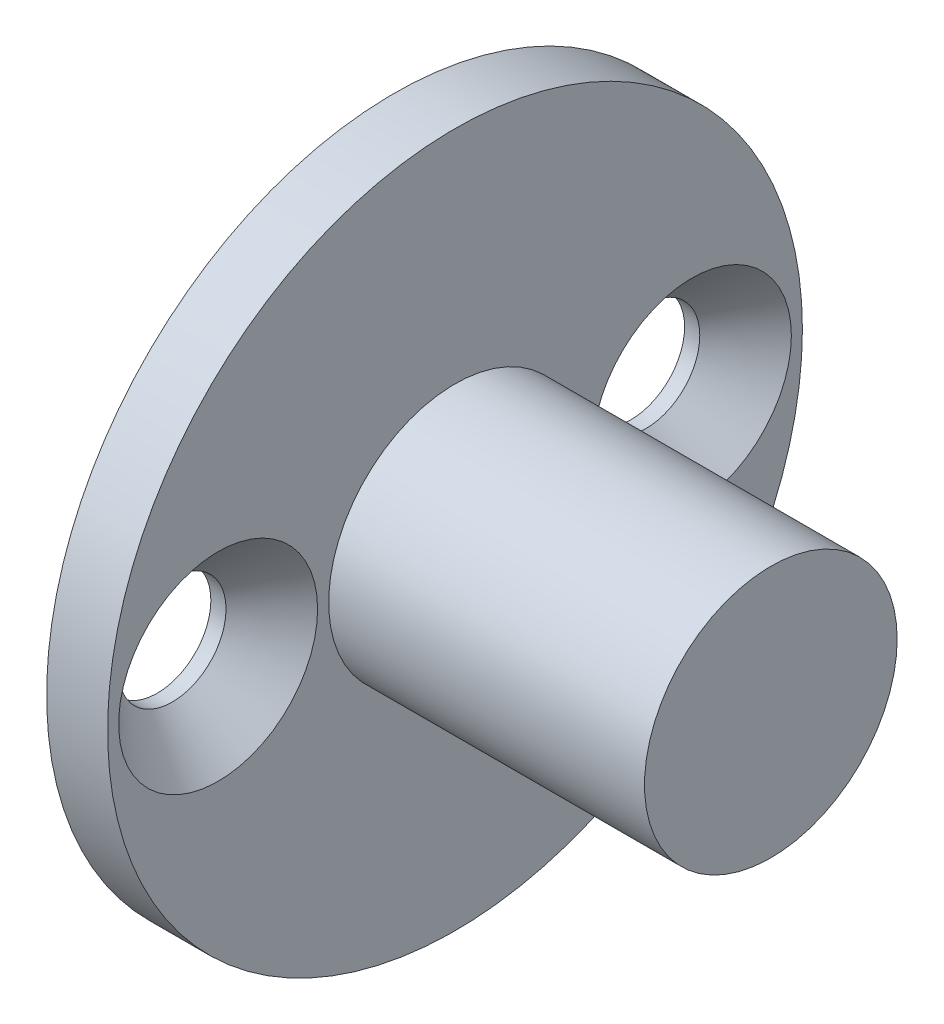
ISO-10303-21;
HEADER;
FILE_DESCRIPTION(('STEP AP214'),'2;1');
FILE_NAME('part.step','',(''),(''),'','','');
FILE_SCHEMA(('AUTOMOTIVE_DESIGN { 1 0 10303 214 1 1 1 1 }'));
ENDSEC;
DATA;
#1=APPLICATION_CONTEXT('core data for automotive mechanical design processes');
#2=APPLICATION_PROTOCOL_DEFINITION('international standard','automotive_design',2000,#1);
#3=PRODUCT_CONTEXT('',#1,'mechanical');
#4=PRODUCT('Part','Part','',(#3));
#5=PRODUCT_RELATED_PRODUCT_CATEGORY('part','',(#4));
#6=PRODUCT_DEFINITION_FORMATION('','',#4);
#7=PRODUCT_DEFINITION_CONTEXT('part definition',#1,'design');
#8=PRODUCT_DEFINITION('design','',#6,#7);
#9=PRODUCT_DEFINITION_SHAPE('','',#8);
#10=(LENGTH_UNIT() NAMED_UNIT(*) SI_UNIT(.MILLI.,.METRE.));
#11=(NAMED_UNIT(*) PLANE_ANGLE_UNIT() SI_UNIT($,.RADIAN.));
#12=(NAMED_UNIT(*) SI_UNIT($,.STERADIAN.) SOLID_ANGLE_UNIT());
#13=UNCERTAINTY_MEASURE_WITH_UNIT(LENGTH_MEASURE(1.E-05),#10,'distance_accuracy_value','');
#14=(GEOMETRIC_REPRESENTATION_CONTEXT(3) GLOBAL_UNCERTAINTY_ASSIGNED_CONTEXT((#13)) GLOBAL_UNIT_ASSIGNED_CONTEXT((#10,
#11,#12)) REPRESENTATION_CONTEXT('',''));
#15=CARTESIAN_POINT('',(0.,0.,0.));
#16=DIRECTION('',(0.,0.,1.));
#17=DIRECTION('',(1.,0.,0.));
#18=AXIS2_PLACEMENT_3D('',#15,#16,#17);
#19=CARTESIAN_POINT('',(1.93,0.,0.));
#20=DIRECTION('',(1.,0.,0.));
#21=DIRECTION('',(0.,0.,-1.));
#22=AXIS2_PLACEMENT_3D('',#19,#20,#21);
#23=PLANE('',#22);
#24=CARTESIAN_POINT('',(1.93,0.,7.5));
#25=DIRECTION('',(1.,0.,0.));
#26=DIRECTION('',(0.,0.,-1.));
#27=AXIS2_PLACEMENT_3D('',#24,#25,#26);
#28=CIRCLE('',#27,3.15);
#29=CARTESIAN_POINT('',(1.93,0.,4.35));
#30=VERTEX_POINT('',#29);
#31=EDGE_CURVE('E72',#30,#30,#28,.T.);
#32=ORIENTED_EDGE('',*,*,#31,.F.);
#33=EDGE_LOOP('',(#32));
#34=FACE_BOUND('',#33,.T.);
#35=CARTESIAN_POINT('',(1.93,0.,-7.5));
#36=DIRECTION('',(1.,0.,0.));
#37=DIRECTION('',(0.,0.,-1.));
#38=AXIS2_PLACEMENT_3D('',#35,#36,#37);
#39=CIRCLE('',#38,3.15);
#40=CARTESIAN_POINT('',(1.93,0.,-10.65));
#41=VERTEX_POINT('',#40);
#42=EDGE_CURVE('E63',#41,#41,#39,.T.);
#43=ORIENTED_EDGE('',*,*,#42,.F.);
#44=EDGE_LOOP('',(#43));
#45=FACE_BOUND('',#44,.T.);
#46=CARTESIAN_POINT('',(1.93,0.,0.));
#47=DIRECTION('',(1.,0.,0.));
#48=DIRECTION('',(0.,0.,-1.));
#49=AXIS2_PLACEMENT_3D('',#46,#47,#48);
#50=CIRCLE('',#49,4.);
#51=CARTESIAN_POINT('',(1.93,0.,-4.));
#52=VERTEX_POINT('',#51);
#53=EDGE_CURVE('E46',#52,#52,#50,.T.);
#54=ORIENTED_EDGE('',*,*,#53,.F.);
#55=EDGE_LOOP('',(#54));
#56=FACE_BOUND('',#55,.T.);
#57=CARTESIAN_POINT('',(1.93,0.,0.));
#58=DIRECTION('',(1.,0.,0.));
#59=DIRECTION('',(0.,0.,-1.));
#60=AXIS2_PLACEMENT_3D('',#57,#58,#59);
#61=CIRCLE('',#60,11.);
#62=CARTESIAN_POINT('',(1.93,0.,-11.));
#63=VERTEX_POINT('',#62);
#64=EDGE_CURVE('E10',#63,#63,#61,.T.);
#65=ORIENTED_EDGE('',*,*,#64,.T.);
#66=EDGE_LOOP('',(#65));
#67=FACE_BOUND('',#66,.T.);
#68=ADVANCED_FACE('F33',(#34,#45,#56,#67),#23,.T.);
#69=CARTESIAN_POINT('',(0.,0.,0.));
#70=DIRECTION('',(1.,0.,0.));
#71=DIRECTION('',(0.,0.,-1.));
#72=AXIS2_PLACEMENT_3D('',#69,#70,#71);
#73=PLANE('',#72);
#74=CARTESIAN_POINT('',(0.,0.,7.5));
#75=DIRECTION('',(1.,0.,0.));
#76=DIRECTION('',(0.,0.,-1.));
#77=AXIS2_PLACEMENT_3D('',#74,#75,#76);
#78=CIRCLE('',#77,1.7);
#79=CARTESIAN_POINT('',(0.,0.,5.8));
#80=VERTEX_POINT('',#79);
#81=EDGE_CURVE('E66',#80,#80,#78,.T.);
#82=ORIENTED_EDGE('',*,*,#81,.T.);
#83=EDGE_LOOP('',(#82));
#84=FACE_BOUND('',#83,.T.);
#85=CARTESIAN_POINT('',(0.,0.,-7.5));
#86=DIRECTION('',(1.,0.,0.));
#87=DIRECTION('',(0.,0.,-1.));
#88=AXIS2_PLACEMENT_3D('',#85,#86,#87);
#89=CIRCLE('',#88,1.7);
#90=CARTESIAN_POINT('',(0.,0.,-9.2));
#91=VERTEX_POINT('',#90);
#92=EDGE_CURVE('E55',#91,#91,#89,.T.);
#93=ORIENTED_EDGE('',*,*,#92,.T.);
#94=EDGE_LOOP('',(#93));
#95=FACE_BOUND('',#94,.T.);
#96=CARTESIAN_POINT('',(0.,0.,0.));
#97=DIRECTION('',(1.,0.,0.));
#98=DIRECTION('',(0.,0.,-1.));
#99=AXIS2_PLACEMENT_3D('',#96,#97,#98);
#100=CIRCLE('',#99,2.15);
#101=CARTESIAN_POINT('',(0.,0.,-2.15));
#102=VERTEX_POINT('',#101);
#103=EDGE_CURVE('E52',#102,#102,#100,.T.);
#104=ORIENTED_EDGE('',*,*,#103,.T.);
#105=EDGE_LOOP('',(#104));
#106=FACE_BOUND('',#105,.T.);
#107=CARTESIAN_POINT('',(0.,0.,0.));
#108=DIRECTION('',(1.,0.,0.));
#109=DIRECTION('',(0.,0.,-1.));
#110=AXIS2_PLACEMENT_3D('',#107,#108,#109);
#111=CIRCLE('',#110,11.);
#112=CARTESIAN_POINT('',(0.,0.,-11.));
#113=VERTEX_POINT('',#112);
#114=EDGE_CURVE('E37',#113,#113,#111,.T.);
#115=ORIENTED_EDGE('',*,*,#114,.F.);
#116=EDGE_LOOP('',(#115));
#117=FACE_BOUND('',#116,.T.);
#118=ADVANCED_FACE('F80',(#84,#95,#106,#117),#73,.F.);
#119=CARTESIAN_POINT('',(1.93,0.,0.));
#120=DIRECTION('',(-1.,0.,0.));
#121=DIRECTION('',(0.,0.,1.));
#122=AXIS2_PLACEMENT_3D('',#119,#120,#121);
#123=CYLINDRICAL_SURFACE('',#122,11.);
#124=ORIENTED_EDGE('',*,*,#64,.F.);
#125=EDGE_LOOP('',(#124));
#126=FACE_BOUND('',#125,.T.);
#127=ORIENTED_EDGE('',*,*,#114,.T.);
#128=EDGE_LOOP('',(#127));
#129=FACE_BOUND('',#128,.T.);
#130=ADVANCED_FACE('F35',(#126,#129),#123,.T.);
#131=CARTESIAN_POINT('',(11.93,0.,0.));
#132=DIRECTION('',(-1.,0.,0.));
#133=DIRECTION('',(0.,0.,1.));
#134=AXIS2_PLACEMENT_3D('',#131,#132,#133);
#135=CYLINDRICAL_SURFACE('',#134,4.);
#136=CARTESIAN_POINT('',(11.93,0.,0.));
#137=DIRECTION('',(1.,0.,0.));
#138=DIRECTION('',(0.,0.,-1.));
#139=AXIS2_PLACEMENT_3D('',#136,#137,#138);
#140=CIRCLE('',#139,4.);
#141=CARTESIAN_POINT('',(11.93,0.,-4.));
#142=VERTEX_POINT('',#141);
#143=EDGE_CURVE('E44',#142,#142,#140,.T.);
#144=ORIENTED_EDGE('',*,*,#143,.F.);
#145=EDGE_LOOP('',(#144));
#146=FACE_BOUND('',#145,.T.);
#147=ORIENTED_EDGE('',*,*,#53,.T.);
#148=EDGE_LOOP('',(#147));
#149=FACE_BOUND('',#148,.T.);
#150=ADVANCED_FACE('F86',(#146,#149),#135,.T.);
#151=CARTESIAN_POINT('',(11.93,0.,0.));
#152=DIRECTION('',(1.,0.,0.));
#153=DIRECTION('',(0.,0.,-1.));
#154=AXIS2_PLACEMENT_3D('',#151,#152,#153);
#155=PLANE('',#154);
#156=ORIENTED_EDGE('',*,*,#143,.T.);
#157=EDGE_LOOP('',(#156));
#158=FACE_BOUND('',#157,.T.);
#159=ADVANCED_FACE('F88',(#158),#155,.T.);
#160=CARTESIAN_POINT('',(6.,0.,0.));
#161=DIRECTION('',(-1.,0.,0.));
#162=DIRECTION('',(0.,0.,1.));
#163=AXIS2_PLACEMENT_3D('',#160,#161,#162);
#164=CYLINDRICAL_SURFACE('',#163,2.15);
#165=CARTESIAN_POINT('',(6.,0.,0.));
#166=DIRECTION('',(1.,0.,0.));
#167=DIRECTION('',(0.,0.,-1.));
#168=AXIS2_PLACEMENT_3D('',#165,#166,#167);
#169=CIRCLE('',#168,2.15);
#170=CARTESIAN_POINT('',(6.,0.,-2.15));
#171=VERTEX_POINT('',#170);
#172=EDGE_CURVE('E49',#171,#171,#169,.T.);
#173=ORIENTED_EDGE('',*,*,#172,.T.);
#174=EDGE_LOOP('',(#173));
#175=FACE_BOUND('',#174,.T.);
#176=ORIENTED_EDGE('',*,*,#103,.F.);
#177=EDGE_LOOP('',(#176));
#178=FACE_BOUND('',#177,.T.);
#179=ADVANCED_FACE('F95',(#175,#178),#164,.F.);
#180=CARTESIAN_POINT('',(6.,0.,0.));
#181=DIRECTION('',(1.,0.,0.));
#182=DIRECTION('',(0.,0.,-1.));
#183=AXIS2_PLACEMENT_3D('',#180,#181,#182);
#184=PLANE('',#183);
#185=ORIENTED_EDGE('',*,*,#172,.F.);
#186=EDGE_LOOP('',(#185));
#187=FACE_BOUND('',#186,.T.);
#188=ADVANCED_FACE('F115',(#187),#184,.F.);
#189=CARTESIAN_POINT('',(1.93,0.,-7.5));
#190=DIRECTION('',(1.,0.,0.));
#191=DIRECTION('',(0.,0.,-1.));
#192=AXIS2_PLACEMENT_3D('',#189,#190,#191);
#193=CYLINDRICAL_SURFACE('',#192,1.7);
#194=ORIENTED_EDGE('',*,*,#92,.F.);
#195=EDGE_LOOP('',(#194));
#196=FACE_BOUND('',#195,.T.);
#197=CARTESIAN_POINT('',(0.48,0.,-7.5));
#198=DIRECTION('',(1.,0.,0.));
#199=DIRECTION('',(0.,0.,-1.));
#200=AXIS2_PLACEMENT_3D('',#197,#198,#199);
#201=CIRCLE('',#200,1.7);
#202=CARTESIAN_POINT('',(0.48,0.,-9.2));
#203=VERTEX_POINT('',#202);
#204=EDGE_CURVE('E60',#203,#203,#201,.T.);
#205=ORIENTED_EDGE('',*,*,#204,.T.);
#206=EDGE_LOOP('',(#205));
#207=FACE_BOUND('',#206,.T.);
#208=ADVANCED_FACE('F120',(#196,#207),#193,.F.);
#209=CARTESIAN_POINT('',(1.93,0.,-7.5));
#210=DIRECTION('',(1.,0.,0.));
#211=DIRECTION('',(0.,0.,-1.));
#212=AXIS2_PLACEMENT_3D('',#209,#210,#211);
#213=CONICAL_SURFACE('',#212,3.15,0.785398163397448);
#214=ORIENTED_EDGE('',*,*,#204,.F.);
#215=EDGE_LOOP('',(#214));
#216=FACE_BOUND('',#215,.T.);
#217=ORIENTED_EDGE('',*,*,#42,.T.);
#218=EDGE_LOOP('',(#217));
#219=FACE_BOUND('',#218,.T.);
#220=ADVANCED_FACE('F126',(#216,#219),#213,.F.);
#221=CARTESIAN_POINT('',(1.93,0.,7.5));
#222=DIRECTION('',(1.,0.,0.));
#223=DIRECTION('',(0.,0.,-1.));
#224=AXIS2_PLACEMENT_3D('',#221,#222,#223);
#225=CYLINDRICAL_SURFACE('',#224,1.7);
#226=ORIENTED_EDGE('',*,*,#81,.F.);
#227=EDGE_LOOP('',(#226));
#228=FACE_BOUND('',#227,.T.);
#229=CARTESIAN_POINT('',(0.48,0.,7.5));
#230=DIRECTION('',(1.,0.,0.));
#231=DIRECTION('',(0.,0.,-1.));
#232=AXIS2_PLACEMENT_3D('',#229,#230,#231);
#233=CIRCLE('',#232,1.7);
#234=CARTESIAN_POINT('',(0.48,0.,5.8));
#235=VERTEX_POINT('',#234);
#236=EDGE_CURVE('E69',#235,#235,#233,.T.);
#237=ORIENTED_EDGE('',*,*,#236,.T.);
#238=EDGE_LOOP('',(#237));
#239=FACE_BOUND('',#238,.T.);
#240=ADVANCED_FACE('F130',(#228,#239),#225,.F.);
#241=CARTESIAN_POINT('',(1.93,0.,7.5));
#242=DIRECTION('',(1.,0.,0.));
#243=DIRECTION('',(0.,0.,-1.));
#244=AXIS2_PLACEMENT_3D('',#241,#242,#243);
#245=CONICAL_SURFACE('',#244,3.15,0.785398163397448);
#246=ORIENTED_EDGE('',*,*,#236,.F.);
#247=EDGE_LOOP('',(#246));
#248=FACE_BOUND('',#247,.T.);
#249=ORIENTED_EDGE('',*,*,#31,.T.);
#250=EDGE_LOOP('',(#249));
#251=FACE_BOUND('',#250,.T.);
#252=ADVANCED_FACE('F76',(#248,#251),#245,.F.);
#253=CLOSED_SHELL('',(#68,#118,#130,#150,#159,#179,#188,#208,#220,#240,#252));
#254=MANIFOLD_SOLID_BREP('B2',#253);
#255=ADVANCED_BREP_SHAPE_REPRESENTATION('',(#18,#254),#14);
#256=SHAPE_DEFINITION_REPRESENTATION(#9,#255);
ENDSEC;
END-ISO-10303-21;
